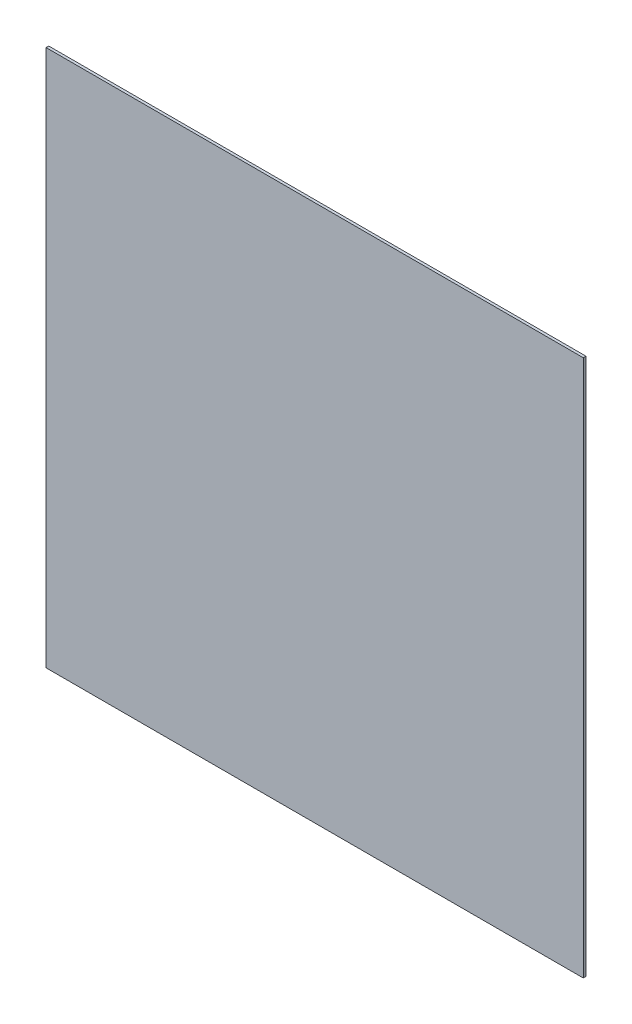
ISO-10303-21;
HEADER;
FILE_DESCRIPTION(('STEP AP214'),'2;1');
FILE_NAME('part.step','',(''),(''),'','','');
FILE_SCHEMA(('AUTOMOTIVE_DESIGN { 1 0 10303 214 1 1 1 1 }'));
ENDSEC;
DATA;
#1=APPLICATION_CONTEXT('core data for automotive mechanical design processes');
#2=APPLICATION_PROTOCOL_DEFINITION('international standard','automotive_design',2000,#1);
#3=PRODUCT_CONTEXT('',#1,'mechanical');
#4=PRODUCT('Part','Part','',(#3));
#5=PRODUCT_RELATED_PRODUCT_CATEGORY('part','',(#4));
#6=PRODUCT_DEFINITION_FORMATION('','',#4);
#7=PRODUCT_DEFINITION_CONTEXT('part definition',#1,'design');
#8=PRODUCT_DEFINITION('design','',#6,#7);
#9=PRODUCT_DEFINITION_SHAPE('','',#8);
#10=(LENGTH_UNIT() NAMED_UNIT(*) SI_UNIT(.MILLI.,.METRE.));
#11=(NAMED_UNIT(*) PLANE_ANGLE_UNIT() SI_UNIT($,.RADIAN.));
#12=(NAMED_UNIT(*) SI_UNIT($,.STERADIAN.) SOLID_ANGLE_UNIT());
#13=UNCERTAINTY_MEASURE_WITH_UNIT(LENGTH_MEASURE(1.E-05),#10,'distance_accuracy_value','');
#14=(GEOMETRIC_REPRESENTATION_CONTEXT(3) GLOBAL_UNCERTAINTY_ASSIGNED_CONTEXT((#13)) GLOBAL_UNIT_ASSIGNED_CONTEXT((#10,
#11,#12)) REPRESENTATION_CONTEXT('',''));
#15=CARTESIAN_POINT('',(0.,0.,0.));
#16=DIRECTION('',(0.,0.,1.));
#17=DIRECTION('',(1.,0.,0.));
#18=AXIS2_PLACEMENT_3D('',#15,#16,#17);
#19=CARTESIAN_POINT('',(609.6,609.6,0.));
#20=DIRECTION('',(1.,0.,0.));
#21=DIRECTION('',(0.,0.,-1.));
#22=AXIS2_PLACEMENT_3D('',#19,#20,#21);
#23=PLANE('',#22);
#24=DIRECTION('',(0.,1.,0.));
#25=VECTOR('',#24,1.);
#26=CARTESIAN_POINT('',(609.6,0.,0.));
#27=LINE('',#26,#25);
#28=CARTESIAN_POINT('',(609.6,0.,0.));
#29=VERTEX_POINT('',#28);
#30=CARTESIAN_POINT('',(609.6,609.6,0.));
#31=VERTEX_POINT('',#30);
#32=EDGE_CURVE('E34',#29,#31,#27,.T.);
#33=ORIENTED_EDGE('',*,*,#32,.F.);
#34=DIRECTION('',(0.,0.,-1.));
#35=VECTOR('',#34,1.);
#36=CARTESIAN_POINT('',(609.6,0.,0.));
#37=LINE('',#36,#35);
#38=CARTESIAN_POINT('',(609.6,0.,-3.048));
#39=VERTEX_POINT('',#38);
#40=EDGE_CURVE('E10',#29,#39,#37,.T.);
#41=ORIENTED_EDGE('',*,*,#40,.T.);
#42=DIRECTION('',(0.,-1.,0.));
#43=VECTOR('',#42,1.);
#44=CARTESIAN_POINT('',(609.6,609.6,-3.048));
#45=LINE('',#44,#43);
#46=CARTESIAN_POINT('',(609.6,609.6,-3.048));
#47=VERTEX_POINT('',#46);
#48=EDGE_CURVE('E78',#47,#39,#45,.T.);
#49=ORIENTED_EDGE('',*,*,#48,.F.);
#50=DIRECTION('',(0.,0.,-1.));
#51=VECTOR('',#50,1.);
#52=CARTESIAN_POINT('',(609.6,609.6,0.));
#53=LINE('',#52,#51);
#54=EDGE_CURVE('E26',#31,#47,#53,.T.);
#55=ORIENTED_EDGE('',*,*,#54,.F.);
#56=EDGE_LOOP('',(#33,#41,#49,#55));
#57=FACE_BOUND('',#56,.T.);
#58=ADVANCED_FACE('F16',(#57),#23,.T.);
#59=CARTESIAN_POINT('',(0.,609.6,0.));
#60=DIRECTION('',(0.,1.,0.));
#61=DIRECTION('',(0.,0.,1.));
#62=AXIS2_PLACEMENT_3D('',#59,#60,#61);
#63=PLANE('',#62);
#64=DIRECTION('',(-1.,0.,0.));
#65=VECTOR('',#64,1.);
#66=CARTESIAN_POINT('',(609.6,609.6,0.));
#67=LINE('',#66,#65);
#68=CARTESIAN_POINT('',(0.,609.6,0.));
#69=VERTEX_POINT('',#68);
#70=EDGE_CURVE('E81',#31,#69,#67,.T.);
#71=ORIENTED_EDGE('',*,*,#70,.F.);
#72=ORIENTED_EDGE('',*,*,#54,.T.);
#73=DIRECTION('',(1.,0.,0.));
#74=VECTOR('',#73,1.);
#75=CARTESIAN_POINT('',(0.,609.6,-3.048));
#76=LINE('',#75,#74);
#77=CARTESIAN_POINT('',(0.,609.6,-3.048));
#78=VERTEX_POINT('',#77);
#79=EDGE_CURVE('E70',#78,#47,#76,.T.);
#80=ORIENTED_EDGE('',*,*,#79,.F.);
#81=DIRECTION('',(0.,0.,-1.));
#82=VECTOR('',#81,1.);
#83=CARTESIAN_POINT('',(0.,609.6,0.));
#84=LINE('',#83,#82);
#85=EDGE_CURVE('E66',#69,#78,#84,.T.);
#86=ORIENTED_EDGE('',*,*,#85,.F.);
#87=EDGE_LOOP('',(#71,#72,#80,#86));
#88=FACE_BOUND('',#87,.T.);
#89=ADVANCED_FACE('F90',(#88),#63,.T.);
#90=CARTESIAN_POINT('',(0.,0.,0.));
#91=DIRECTION('',(-1.,0.,0.));
#92=DIRECTION('',(0.,0.,1.));
#93=AXIS2_PLACEMENT_3D('',#90,#91,#92);
#94=PLANE('',#93);
#95=DIRECTION('',(0.,-1.,0.));
#96=VECTOR('',#95,1.);
#97=CARTESIAN_POINT('',(0.,609.6,0.));
#98=LINE('',#97,#96);
#99=CARTESIAN_POINT('',(0.,0.,0.));
#100=VERTEX_POINT('',#99);
#101=EDGE_CURVE('E54',#69,#100,#98,.T.);
#102=ORIENTED_EDGE('',*,*,#101,.F.);
#103=ORIENTED_EDGE('',*,*,#85,.T.);
#104=DIRECTION('',(0.,1.,0.));
#105=VECTOR('',#104,1.);
#106=CARTESIAN_POINT('',(0.,0.,-3.048));
#107=LINE('',#106,#105);
#108=CARTESIAN_POINT('',(0.,0.,-3.048));
#109=VERTEX_POINT('',#108);
#110=EDGE_CURVE('E60',#109,#78,#107,.T.);
#111=ORIENTED_EDGE('',*,*,#110,.F.);
#112=DIRECTION('',(0.,0.,-1.));
#113=VECTOR('',#112,1.);
#114=CARTESIAN_POINT('',(0.,0.,0.));
#115=LINE('',#114,#113);
#116=EDGE_CURVE('E63',#100,#109,#115,.T.);
#117=ORIENTED_EDGE('',*,*,#116,.F.);
#118=EDGE_LOOP('',(#102,#103,#111,#117));
#119=FACE_BOUND('',#118,.T.);
#120=ADVANCED_FACE('F62',(#119),#94,.T.);
#121=CARTESIAN_POINT('',(609.6,0.,0.));
#122=DIRECTION('',(0.,-1.,0.));
#123=DIRECTION('',(0.,0.,-1.));
#124=AXIS2_PLACEMENT_3D('',#121,#122,#123);
#125=PLANE('',#124);
#126=DIRECTION('',(1.,0.,0.));
#127=VECTOR('',#126,1.);
#128=CARTESIAN_POINT('',(0.,0.,0.));
#129=LINE('',#128,#127);
#130=EDGE_CURVE('E75',#100,#29,#129,.T.);
#131=ORIENTED_EDGE('',*,*,#130,.F.);
#132=ORIENTED_EDGE('',*,*,#116,.T.);
#133=DIRECTION('',(-1.,0.,0.));
#134=VECTOR('',#133,1.);
#135=CARTESIAN_POINT('',(609.6,0.,-3.048));
#136=LINE('',#135,#134);
#137=EDGE_CURVE('E20',#39,#109,#136,.T.);
#138=ORIENTED_EDGE('',*,*,#137,.F.);
#139=ORIENTED_EDGE('',*,*,#40,.F.);
#140=EDGE_LOOP('',(#131,#132,#138,#139));
#141=FACE_BOUND('',#140,.T.);
#142=ADVANCED_FACE('F74',(#141),#125,.T.);
#143=CARTESIAN_POINT('',(304.8,304.8,-3.048));
#144=DIRECTION('',(0.,0.,1.));
#145=DIRECTION('',(1.,0.,0.));
#146=AXIS2_PLACEMENT_3D('',#143,#144,#145);
#147=PLANE('',#146);
#148=ORIENTED_EDGE('',*,*,#137,.T.);
#149=ORIENTED_EDGE('',*,*,#110,.T.);
#150=ORIENTED_EDGE('',*,*,#79,.T.);
#151=ORIENTED_EDGE('',*,*,#48,.T.);
#152=EDGE_LOOP('',(#148,#149,#150,#151));
#153=FACE_BOUND('',#152,.T.);
#154=ADVANCED_FACE('F77',(#153),#147,.F.);
#155=CARTESIAN_POINT('',(304.8,304.8,0.));
#156=DIRECTION('',(0.,0.,1.));
#157=DIRECTION('',(1.,0.,0.));
#158=AXIS2_PLACEMENT_3D('',#155,#156,#157);
#159=PLANE('',#158);
#160=ORIENTED_EDGE('',*,*,#130,.T.);
#161=ORIENTED_EDGE('',*,*,#32,.T.);
#162=ORIENTED_EDGE('',*,*,#70,.T.);
#163=ORIENTED_EDGE('',*,*,#101,.T.);
#164=EDGE_LOOP('',(#160,#161,#162,#163));
#165=FACE_BOUND('',#164,.T.);
#166=ADVANCED_FACE('F18',(#165),#159,.T.);
#167=CLOSED_SHELL('',(#58,#89,#120,#142,#154,#166));
#168=MANIFOLD_SOLID_BREP('B1',#167);
#169=ADVANCED_BREP_SHAPE_REPRESENTATION('',(#18,#168),#14);
#170=SHAPE_DEFINITION_REPRESENTATION(#9,#169);
ENDSEC;
END-ISO-10303-21;
